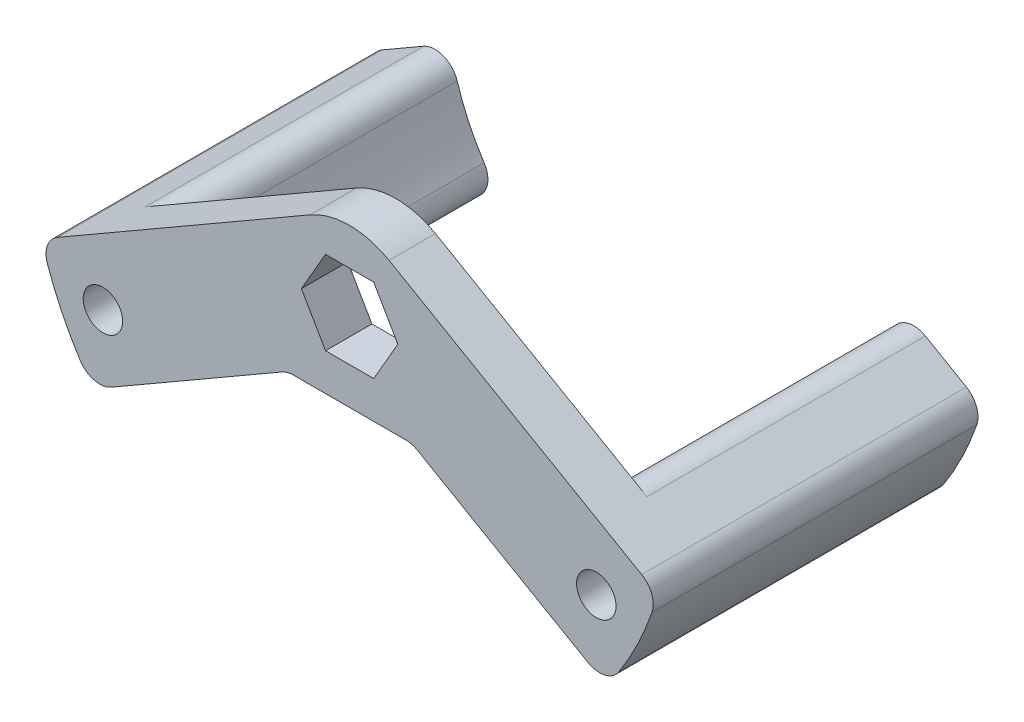
ISO-10303-21;
HEADER;
FILE_DESCRIPTION(('STEP AP214'),'2;1');
FILE_NAME('part.step','',(''),(''),'','','');
FILE_SCHEMA(('AUTOMOTIVE_DESIGN { 1 0 10303 214 1 1 1 1 }'));
ENDSEC;
DATA;
#1=APPLICATION_CONTEXT('core data for automotive mechanical design processes');
#2=APPLICATION_PROTOCOL_DEFINITION('international standard','automotive_design',2000,#1);
#3=PRODUCT_CONTEXT('',#1,'mechanical');
#4=PRODUCT('Part','Part','',(#3));
#5=PRODUCT_RELATED_PRODUCT_CATEGORY('part','',(#4));
#6=PRODUCT_DEFINITION_FORMATION('','',#4);
#7=PRODUCT_DEFINITION_CONTEXT('part definition',#1,'design');
#8=PRODUCT_DEFINITION('design','',#6,#7);
#9=PRODUCT_DEFINITION_SHAPE('','',#8);
#10=(LENGTH_UNIT() NAMED_UNIT(*) SI_UNIT(.MILLI.,.METRE.));
#11=(NAMED_UNIT(*) PLANE_ANGLE_UNIT() SI_UNIT($,.RADIAN.));
#12=(NAMED_UNIT(*) SI_UNIT($,.STERADIAN.) SOLID_ANGLE_UNIT());
#13=UNCERTAINTY_MEASURE_WITH_UNIT(LENGTH_MEASURE(1.E-05),#10,'distance_accuracy_value','');
#14=(GEOMETRIC_REPRESENTATION_CONTEXT(3) GLOBAL_UNCERTAINTY_ASSIGNED_CONTEXT((#13)) GLOBAL_UNIT_ASSIGNED_CONTEXT((#10,
#11,#12)) REPRESENTATION_CONTEXT('',''));
#15=CARTESIAN_POINT('',(0.,0.,0.));
#16=DIRECTION('',(0.,0.,1.));
#17=DIRECTION('',(1.,0.,0.));
#18=AXIS2_PLACEMENT_3D('',#15,#16,#17);
#19=CARTESIAN_POINT('',(0.,0.,-6.));
#20=DIRECTION('',(0.,0.,1.));
#21=DIRECTION('',(1.,0.,0.));
#22=AXIS2_PLACEMENT_3D('',#19,#20,#21);
#23=CYLINDRICAL_SURFACE('',#22,4.9);
#24=CARTESIAN_POINT('',(0.,0.,0.));
#25=DIRECTION('',(0.,0.,1.));
#26=DIRECTION('',(1.,0.,0.));
#27=AXIS2_PLACEMENT_3D('',#24,#25,#26);
#28=CIRCLE('',#27,4.9);
#29=CARTESIAN_POINT('',(-4.68186401958312,-1.44573486578036,0.));
#30=VERTEX_POINT('',#29);
#31=CARTESIAN_POINT('',(-4.10085965776331,-2.68196757387732,0.));
#32=VERTEX_POINT('',#31);
#33=EDGE_CURVE('E297',#30,#32,#28,.T.);
#34=ORIENTED_EDGE('',*,*,#33,.T.);
#35=DIRECTION('',(0.,0.,1.));
#36=VECTOR('',#35,1.);
#37=CARTESIAN_POINT('',(-4.10085965776331,-2.68196757387732,-6.));
#38=LINE('',#37,#36);
#39=CARTESIAN_POINT('',(-4.10085965776331,-2.68196757387732,-6.));
#40=VERTEX_POINT('',#39);
#41=EDGE_CURVE('E320',#32,#40,#38,.F.);
#42=ORIENTED_EDGE('',*,*,#41,.T.);
#43=CARTESIAN_POINT('',(0.,0.,-6.));
#44=DIRECTION('',(0.,0.,-1.));
#45=DIRECTION('',(-1.,0.,0.));
#46=AXIS2_PLACEMENT_3D('',#43,#44,#45);
#47=CIRCLE('',#46,4.9);
#48=CARTESIAN_POINT('',(-4.68186401958312,-1.44573486578036,-6.));
#49=VERTEX_POINT('',#48);
#50=EDGE_CURVE('E430',#40,#49,#47,.T.);
#51=ORIENTED_EDGE('',*,*,#50,.T.);
#52=DIRECTION('',(0.,0.,1.));
#53=VECTOR('',#52,1.);
#54=CARTESIAN_POINT('',(-4.68186401958312,-1.44573486578036,-6.));
#55=LINE('',#54,#53);
#56=EDGE_CURVE('E317',#49,#30,#55,.T.);
#57=ORIENTED_EDGE('',*,*,#56,.T.);
#58=EDGE_LOOP('',(#34,#42,#51,#57));
#59=FACE_BOUND('',#58,.T.);
#60=ADVANCED_FACE('F34',(#59),#23,.F.);
#61=CARTESIAN_POINT('',(0.,0.,-6.));
#62=DIRECTION('',(0.,0.,1.));
#63=DIRECTION('',(1.,0.,0.));
#64=AXIS2_PLACEMENT_3D('',#61,#62,#63);
#65=CYLINDRICAL_SURFACE('',#64,6.9);
#66=CARTESIAN_POINT('',(0.,0.,1.));
#67=DIRECTION('',(0.,0.,1.));
#68=DIRECTION('',(-1.,0.,0.));
#69=AXIS2_PLACEMENT_3D('',#66,#67,#68);
#70=CIRCLE('',#69,6.9);
#71=CARTESIAN_POINT('',(-6.51647108517698,-2.2683925136652,1.));
#72=VERTEX_POINT('',#71);
#73=CARTESIAN_POINT('',(-5.80728796282042,-3.72631272397809,1.));
#74=VERTEX_POINT('',#73);
#75=EDGE_CURVE('E420',#72,#74,#70,.T.);
#76=ORIENTED_EDGE('',*,*,#75,.F.);
#77=DIRECTION('',(0.,0.,1.));
#78=VECTOR('',#77,1.);
#79=CARTESIAN_POINT('',(-6.51647108517698,-2.2683925136652,-6.));
#80=LINE('',#79,#78);
#81=CARTESIAN_POINT('',(-6.51647108517698,-2.2683925136652,-6.));
#82=VERTEX_POINT('',#81);
#83=EDGE_CURVE('E376',#72,#82,#80,.F.);
#84=ORIENTED_EDGE('',*,*,#83,.T.);
#85=CARTESIAN_POINT('',(0.,0.,-6.));
#86=DIRECTION('',(0.,0.,1.));
#87=DIRECTION('',(-1.,0.,0.));
#88=AXIS2_PLACEMENT_3D('',#85,#86,#87);
#89=CIRCLE('',#88,6.9);
#90=CARTESIAN_POINT('',(-5.80728796282042,-3.72631272397809,-6.));
#91=VERTEX_POINT('',#90);
#92=EDGE_CURVE('E426',#82,#91,#89,.T.);
#93=ORIENTED_EDGE('',*,*,#92,.T.);
#94=DIRECTION('',(0.,0.,1.));
#95=VECTOR('',#94,1.);
#96=CARTESIAN_POINT('',(-5.80728796282043,-3.72631272397809,-6.));
#97=LINE('',#96,#95);
#98=EDGE_CURVE('E373',#91,#74,#97,.T.);
#99=ORIENTED_EDGE('',*,*,#98,.T.);
#100=EDGE_LOOP('',(#76,#84,#93,#99));
#101=FACE_BOUND('',#100,.T.);
#102=ADVANCED_FACE('F439',(#101),#65,.T.);
#103=CARTESIAN_POINT('',(0.,0.,-6.));
#104=DIRECTION('',(0.,0.,-1.));
#105=DIRECTION('',(-1.,0.,0.));
#106=AXIS2_PLACEMENT_3D('',#103,#104,#105);
#107=PLANE('',#106);
#108=CARTESIAN_POINT('',(-5.3173272759862,-2.53816456696657,-6.));
#109=DIRECTION('',(0.,0.,-1.));
#110=DIRECTION('',(1.,0.,0.));
#111=AXIS2_PLACEMENT_3D('',#108,#109,#110);
#112=CIRCLE('',#111,0.425);
#113=CARTESIAN_POINT('',(-4.8923272759862,-2.53816456696657,-6.));
#114=VERTEX_POINT('',#113);
#115=EDGE_CURVE('E541',#114,#114,#112,.T.);
#116=ORIENTED_EDGE('',*,*,#115,.F.);
#117=EDGE_LOOP('',(#116));
#118=FACE_BOUND('',#117,.T.);
#119=ORIENTED_EDGE('',*,*,#50,.F.);
#120=CARTESIAN_POINT('',(-4.51931472488201,-2.95563773447704,-6.));
#121=DIRECTION('',(0.,0.,-1.));
#122=DIRECTION('',(-1.,0.,0.));
#123=AXIS2_PLACEMENT_3D('',#120,#121,#122);
#124=CIRCLE('',#123,0.5);
#125=CARTESIAN_POINT('',(-4.26931472488201,-3.38865043636926,-6.));
#126=VERTEX_POINT('',#125);
#127=EDGE_CURVE('E328',#40,#126,#124,.T.);
#128=ORIENTED_EDGE('',*,*,#127,.T.);
#129=DIRECTION('',(0.866025403784439,0.5,0.));
#130=VECTOR('',#129,1.);
#131=CARTESIAN_POINT('',(0.4,-0.69282032302755,-6.));
#132=LINE('',#131,#130);
#133=CARTESIAN_POINT('',(-5.1364699945001,-3.88930276471247,-6.));
#134=VERTEX_POINT('',#133);
#135=EDGE_CURVE('E304',#134,#126,#132,.T.);
#136=ORIENTED_EDGE('',*,*,#135,.F.);
#137=CARTESIAN_POINT('',(-5.3864699945001,-3.45629006282025,-6.));
#138=DIRECTION('',(0.,0.,-1.));
#139=DIRECTION('',(-1.,0.,0.));
#140=AXIS2_PLACEMENT_3D('',#137,#138,#139);
#141=CIRCLE('',#140,0.5);
#142=EDGE_CURVE('E322',#134,#91,#141,.T.);
#143=ORIENTED_EDGE('',*,*,#142,.T.);
#144=ORIENTED_EDGE('',*,*,#92,.F.);
#145=CARTESIAN_POINT('',(-6.04426303552647,-2.10401624455902,-6.));
#146=DIRECTION('',(0.,0.,-1.));
#147=DIRECTION('',(-1.,0.,0.));
#148=AXIS2_PLACEMENT_3D('',#145,#146,#147);
#149=CIRCLE('',#148,0.5);
#150=CARTESIAN_POINT('',(-6.29426303552648,-1.6710035426668,-6.));
#151=VERTEX_POINT('',#150);
#152=EDGE_CURVE('E324',#82,#151,#149,.T.);
#153=ORIENTED_EDGE('',*,*,#152,.T.);
#154=DIRECTION('',(-0.86602540378444,-0.499999999999997,0.));
#155=VECTOR('',#154,1.);
#156=CARTESIAN_POINT('',(-6.6413728942281,-1.87140751302655,-6.));
#157=LINE('',#156,#155);
#158=CARTESIAN_POINT('',(-5.4096052460712,-1.1602461297841,-6.));
#159=VERTEX_POINT('',#158);
#160=EDGE_CURVE('E259',#159,#151,#157,.T.);
#161=ORIENTED_EDGE('',*,*,#160,.F.);
#162=CARTESIAN_POINT('',(-5.15960524607119,-1.59325883167632,-6.));
#163=DIRECTION('',(0.,0.,-1.));
#164=DIRECTION('',(-1.,0.,0.));
#165=AXIS2_PLACEMENT_3D('',#162,#163,#164);
#166=CIRCLE('',#165,0.5);
#167=EDGE_CURVE('E326',#159,#49,#166,.T.);
#168=ORIENTED_EDGE('',*,*,#167,.T.);
#169=EDGE_LOOP('',(#119,#128,#136,#143,#144,#153,#161,#168));
#170=FACE_BOUND('',#169,.T.);
#171=ADVANCED_FACE('F450',(#118,#170),#107,.T.);
#172=CARTESIAN_POINT('',(0.,0.,1.));
#173=DIRECTION('',(0.,0.,1.));
#174=DIRECTION('',(1.,0.,0.));
#175=AXIS2_PLACEMENT_3D('',#172,#173,#174);
#176=PLANE('',#175);
#177=CARTESIAN_POINT('',(5.3173272759862,-2.53816456696657,1.));
#178=DIRECTION('',(0.,0.,-1.));
#179=DIRECTION('',(-1.,0.,0.));
#180=AXIS2_PLACEMENT_3D('',#177,#178,#179);
#181=CIRCLE('',#180,0.425);
#182=CARTESIAN_POINT('',(4.8923272759862,-2.53816456696657,1.));
#183=VERTEX_POINT('',#182);
#184=EDGE_CURVE('E544',#183,#183,#181,.T.);
#185=ORIENTED_EDGE('',*,*,#184,.T.);
#186=EDGE_LOOP('',(#185));
#187=FACE_BOUND('',#186,.T.);
#188=CARTESIAN_POINT('',(-5.3173272759862,-2.53816456696657,1.));
#189=DIRECTION('',(0.,0.,-1.));
#190=DIRECTION('',(1.,0.,0.));
#191=AXIS2_PLACEMENT_3D('',#188,#189,#190);
#192=CIRCLE('',#191,0.425);
#193=CARTESIAN_POINT('',(-4.8923272759862,-2.53816456696657,1.));
#194=VERTEX_POINT('',#193);
#195=EDGE_CURVE('E804',#194,#194,#192,.T.);
#196=ORIENTED_EDGE('',*,*,#195,.T.);
#197=EDGE_LOOP('',(#196));
#198=FACE_BOUND('',#197,.T.);
#199=CARTESIAN_POINT('',(5.80728796282042,-3.72631272397809,1.));
#200=VERTEX_POINT('',#199);
#201=CARTESIAN_POINT('',(6.51647108517698,-2.2683925136652,1.));
#202=VERTEX_POINT('',#201);
#203=EDGE_CURVE('E417',#200,#202,#70,.T.);
#204=ORIENTED_EDGE('',*,*,#203,.T.);
#205=CARTESIAN_POINT('',(6.04426303552648,-2.10401624455902,1.));
#206=DIRECTION('',(0.,0.,1.));
#207=DIRECTION('',(1.,0.,0.));
#208=AXIS2_PLACEMENT_3D('',#205,#206,#207);
#209=CIRCLE('',#208,0.5);
#210=CARTESIAN_POINT('',(6.29426303552648,-1.67100354266681,1.));
#211=VERTEX_POINT('',#210);
#212=EDGE_CURVE('E371',#202,#211,#209,.T.);
#213=ORIENTED_EDGE('',*,*,#212,.T.);
#214=DIRECTION('',(-0.866025403784438,0.500000000000001,0.));
#215=VECTOR('',#214,1.);
#216=CARTESIAN_POINT('',(0.850000000000002,1.47224318643355,1.));
#217=LINE('',#216,#215);
#218=CARTESIAN_POINT('',(0.850000000000002,1.47224318643355,1.));
#219=VERTEX_POINT('',#218);
#220=EDGE_CURVE('E287',#211,#219,#217,.T.);
#221=ORIENTED_EDGE('',*,*,#220,.T.);
#222=CARTESIAN_POINT('',(0.,0.,1.));
#223=DIRECTION('',(0.,0.,1.));
#224=DIRECTION('',(1.,0.,0.));
#225=AXIS2_PLACEMENT_3D('',#222,#223,#224);
#226=CIRCLE('',#225,1.7);
#227=CARTESIAN_POINT('',(-0.850000000000002,1.47224318643355,1.));
#228=VERTEX_POINT('',#227);
#229=EDGE_CURVE('E280',#219,#228,#226,.T.);
#230=ORIENTED_EDGE('',*,*,#229,.T.);
#231=DIRECTION('',(-0.866025403784438,-0.500000000000001,0.));
#232=VECTOR('',#231,1.);
#233=CARTESIAN_POINT('',(-4.82994974842648,-0.825581872181673,1.));
#234=LINE('',#233,#232);
#235=CARTESIAN_POINT('',(-6.29426303552648,-1.67100354266681,1.));
#236=VERTEX_POINT('',#235);
#237=EDGE_CURVE('E283',#228,#236,#234,.T.);
#238=ORIENTED_EDGE('',*,*,#237,.T.);
#239=CARTESIAN_POINT('',(-6.04426303552647,-2.10401624455902,1.));
#240=DIRECTION('',(0.,0.,1.));
#241=DIRECTION('',(1.,0.,0.));
#242=AXIS2_PLACEMENT_3D('',#239,#240,#241);
#243=CIRCLE('',#242,0.5);
#244=EDGE_CURVE('E369',#236,#72,#243,.T.);
#245=ORIENTED_EDGE('',*,*,#244,.T.);
#246=ORIENTED_EDGE('',*,*,#75,.T.);
#247=CARTESIAN_POINT('',(-5.3864699945001,-3.45629006282025,1.));
#248=DIRECTION('',(0.,0.,1.));
#249=DIRECTION('',(1.,0.,0.));
#250=AXIS2_PLACEMENT_3D('',#247,#248,#249);
#251=CIRCLE('',#250,0.5);
#252=CARTESIAN_POINT('',(-5.1364699945001,-3.88930276471247,1.));
#253=VERTEX_POINT('',#252);
#254=EDGE_CURVE('E365',#74,#253,#251,.T.);
#255=ORIENTED_EDGE('',*,*,#254,.T.);
#256=DIRECTION('',(-0.866025403784438,-0.5,0.));
#257=VECTOR('',#256,1.);
#258=CARTESIAN_POINT('',(-1.3444863728671,-1.70000000000001,1.));
#259=LINE('',#258,#257);
#260=CARTESIAN_POINT('',(-1.46051177665154,-1.76698729810779,1.));
#261=VERTEX_POINT('',#260);
#262=EDGE_CURVE('E400',#261,#253,#259,.T.);
#263=ORIENTED_EDGE('',*,*,#262,.F.);
#264=CARTESIAN_POINT('',(-1.21051177665154,-2.20000000000001,1.));
#265=DIRECTION('',(0.,0.,1.));
#266=DIRECTION('',(1.,0.,0.));
#267=AXIS2_PLACEMENT_3D('',#264,#265,#266);
#268=CIRCLE('',#267,0.5);
#269=CARTESIAN_POINT('',(-1.21051177665154,-1.70000000000001,1.));
#270=VERTEX_POINT('',#269);
#271=EDGE_CURVE('E42',#261,#270,#268,.F.);
#272=ORIENTED_EDGE('',*,*,#271,.T.);
#273=DIRECTION('',(-1.,0.,0.));
#274=VECTOR('',#273,1.);
#275=CARTESIAN_POINT('',(-1.3444863728671,-1.70000000000001,1.));
#276=LINE('',#275,#274);
#277=CARTESIAN_POINT('',(1.21051177665153,-1.70000000000001,1.));
#278=VERTEX_POINT('',#277);
#279=EDGE_CURVE('E398',#278,#270,#276,.T.);
#280=ORIENTED_EDGE('',*,*,#279,.F.);
#281=CARTESIAN_POINT('',(1.21051177665153,-2.20000000000001,1.));
#282=DIRECTION('',(0.,0.,1.));
#283=DIRECTION('',(1.,0.,0.));
#284=AXIS2_PLACEMENT_3D('',#281,#282,#283);
#285=CIRCLE('',#284,0.5);
#286=CARTESIAN_POINT('',(1.46051177665153,-1.76698729810779,1.));
#287=VERTEX_POINT('',#286);
#288=EDGE_CURVE('E392',#278,#287,#285,.F.);
#289=ORIENTED_EDGE('',*,*,#288,.T.);
#290=DIRECTION('',(-0.866025403784439,0.5,0.));
#291=VECTOR('',#290,1.);
#292=CARTESIAN_POINT('',(1.34448637286709,-1.70000000000001,1.));
#293=LINE('',#292,#291);
#294=CARTESIAN_POINT('',(5.1364699945001,-3.88930276471248,1.));
#295=VERTEX_POINT('',#294);
#296=EDGE_CURVE('E406',#295,#287,#293,.T.);
#297=ORIENTED_EDGE('',*,*,#296,.F.);
#298=CARTESIAN_POINT('',(5.3864699945001,-3.45629006282026,1.));
#299=DIRECTION('',(0.,0.,1.));
#300=DIRECTION('',(1.,0.,0.));
#301=AXIS2_PLACEMENT_3D('',#298,#299,#300);
#302=CIRCLE('',#301,0.5);
#303=EDGE_CURVE('E367',#295,#200,#302,.T.);
#304=ORIENTED_EDGE('',*,*,#303,.T.);
#305=EDGE_LOOP('',(#204,#213,#221,#230,#238,#245,#246,#255,#263,#272,#280,#289,#297,#304));
#306=FACE_BOUND('',#305,.T.);
#307=DIRECTION('',(-0.500000000000001,0.866025403784438,0.));
#308=VECTOR('',#307,1.);
#309=CARTESIAN_POINT('',(1.03923048454133,0.,1.));
#310=LINE('',#309,#308);
#311=CARTESIAN_POINT('',(1.03923048454133,0.,1.));
#312=VERTEX_POINT('',#311);
#313=CARTESIAN_POINT('',(0.519615242270662,0.900000000000002,1.));
#314=VERTEX_POINT('',#313);
#315=EDGE_CURVE('E231',#312,#314,#310,.T.);
#316=ORIENTED_EDGE('',*,*,#315,.F.);
#317=DIRECTION('',(0.499999999999995,0.866025403784442,0.));
#318=VECTOR('',#317,1.);
#319=CARTESIAN_POINT('',(0.519615242270674,-0.899999999999995,1.));
#320=LINE('',#319,#318);
#321=CARTESIAN_POINT('',(0.519615242270674,-0.899999999999995,1.));
#322=VERTEX_POINT('',#321);
#323=EDGE_CURVE('E221',#322,#312,#320,.T.);
#324=ORIENTED_EDGE('',*,*,#323,.F.);
#325=DIRECTION('',(1.,0.,0.));
#326=VECTOR('',#325,1.);
#327=CARTESIAN_POINT('',(-0.519615242270655,-0.900000000000006,1.));
#328=LINE('',#327,#326);
#329=CARTESIAN_POINT('',(-0.519615242270655,-0.900000000000006,1.));
#330=VERTEX_POINT('',#329);
#331=EDGE_CURVE('E255',#330,#322,#328,.T.);
#332=ORIENTED_EDGE('',*,*,#331,.F.);
#333=DIRECTION('',(0.500000000000007,-0.866025403784435,0.));
#334=VECTOR('',#333,1.);
#335=CARTESIAN_POINT('',(-1.03923048454133,0.,1.));
#336=LINE('',#335,#334);
#337=CARTESIAN_POINT('',(-1.03923048454133,0.,1.));
#338=VERTEX_POINT('',#337);
#339=EDGE_CURVE('E252',#338,#330,#336,.T.);
#340=ORIENTED_EDGE('',*,*,#339,.F.);
#341=DIRECTION('',(-0.499999999999995,-0.866025403784441,0.));
#342=VECTOR('',#341,1.);
#343=CARTESIAN_POINT('',(-0.519615242270668,0.899999999999998,1.));
#344=LINE('',#343,#342);
#345=CARTESIAN_POINT('',(-0.519615242270668,0.899999999999998,1.));
#346=VERTEX_POINT('',#345);
#347=EDGE_CURVE('E247',#346,#338,#344,.T.);
#348=ORIENTED_EDGE('',*,*,#347,.F.);
#349=DIRECTION('',(-1.,0.,0.));
#350=VECTOR('',#349,1.);
#351=CARTESIAN_POINT('',(0.519615242270662,0.900000000000002,1.));
#352=LINE('',#351,#350);
#353=EDGE_CURVE('E245',#314,#346,#352,.T.);
#354=ORIENTED_EDGE('',*,*,#353,.F.);
#355=EDGE_LOOP('',(#316,#324,#332,#340,#348,#354));
#356=FACE_BOUND('',#355,.T.);
#357=ADVANCED_FACE('F243',(#187,#198,#306,#356),#176,.T.);
#358=CARTESIAN_POINT('',(0.,0.,0.));
#359=DIRECTION('',(0.,0.,1.));
#360=DIRECTION('',(1.,0.,0.));
#361=AXIS2_PLACEMENT_3D('',#358,#359,#360);
#362=PLANE('',#361);
#363=DIRECTION('',(-0.866025403784439,0.5,0.));
#364=VECTOR('',#363,1.);
#365=CARTESIAN_POINT('',(-0.400000000000004,-0.692820323027558,0.));
#366=LINE('',#365,#364);
#367=CARTESIAN_POINT('',(4.26931472488201,-3.38865043636927,0.));
#368=VERTEX_POINT('',#367);
#369=CARTESIAN_POINT('',(1.46051177665153,-1.76698729810779,0.));
#370=VERTEX_POINT('',#369);
#371=EDGE_CURVE('E418',#368,#370,#366,.T.);
#372=ORIENTED_EDGE('',*,*,#371,.T.);
#373=CARTESIAN_POINT('',(1.21051177665153,-2.20000000000001,0.));
#374=DIRECTION('',(0.,0.,1.));
#375=DIRECTION('',(1.,0.,0.));
#376=AXIS2_PLACEMENT_3D('',#373,#374,#375);
#377=CIRCLE('',#376,0.5);
#378=CARTESIAN_POINT('',(1.21051177665153,-1.70000000000001,0.));
#379=VERTEX_POINT('',#378);
#380=EDGE_CURVE('E56',#370,#379,#377,.T.);
#381=ORIENTED_EDGE('',*,*,#380,.T.);
#382=DIRECTION('',(-1.,0.,0.));
#383=VECTOR('',#382,1.);
#384=CARTESIAN_POINT('',(0.,-1.70000000000001,0.));
#385=LINE('',#384,#383);
#386=CARTESIAN_POINT('',(-1.21051177665154,-1.70000000000001,0.));
#387=VERTEX_POINT('',#386);
#388=EDGE_CURVE('E307',#379,#387,#385,.T.);
#389=ORIENTED_EDGE('',*,*,#388,.T.);
#390=CARTESIAN_POINT('',(-1.21051177665154,-2.20000000000001,0.));
#391=DIRECTION('',(0.,0.,1.));
#392=DIRECTION('',(1.,0.,0.));
#393=AXIS2_PLACEMENT_3D('',#390,#391,#392);
#394=CIRCLE('',#393,0.5);
#395=CARTESIAN_POINT('',(-1.46051177665154,-1.76698729810779,0.));
#396=VERTEX_POINT('',#395);
#397=EDGE_CURVE('E11',#387,#396,#394,.T.);
#398=ORIENTED_EDGE('',*,*,#397,.T.);
#399=DIRECTION('',(-0.866025403784439,-0.5,0.));
#400=VECTOR('',#399,1.);
#401=CARTESIAN_POINT('',(0.4,-0.69282032302755,0.));
#402=LINE('',#401,#400);
#403=CARTESIAN_POINT('',(-4.26931472488201,-3.38865043636926,0.));
#404=VERTEX_POINT('',#403);
#405=EDGE_CURVE('E412',#396,#404,#402,.T.);
#406=ORIENTED_EDGE('',*,*,#405,.T.);
#407=CARTESIAN_POINT('',(-4.51931472488201,-2.95563773447704,0.));
#408=DIRECTION('',(0.,0.,1.));
#409=DIRECTION('',(1.,0.,0.));
#410=AXIS2_PLACEMENT_3D('',#407,#408,#409);
#411=CIRCLE('',#410,0.5);
#412=EDGE_CURVE('E382',#404,#32,#411,.T.);
#413=ORIENTED_EDGE('',*,*,#412,.T.);
#414=ORIENTED_EDGE('',*,*,#33,.F.);
#415=CARTESIAN_POINT('',(-5.15960524607119,-1.59325883167632,0.));
#416=DIRECTION('',(0.,0.,1.));
#417=DIRECTION('',(1.,0.,0.));
#418=AXIS2_PLACEMENT_3D('',#415,#416,#417);
#419=CIRCLE('',#418,0.5);
#420=CARTESIAN_POINT('',(-5.4096052460712,-1.1602461297841,0.));
#421=VERTEX_POINT('',#420);
#422=EDGE_CURVE('E389',#30,#421,#419,.T.);
#423=ORIENTED_EDGE('',*,*,#422,.T.);
#424=DIRECTION('',(-0.866025403784438,-0.500000000000001,0.));
#425=VECTOR('',#424,1.);
#426=CARTESIAN_POINT('',(-4.82994974842648,-0.825581872181673,0.));
#427=LINE('',#426,#425);
#428=CARTESIAN_POINT('',(-0.850000000000002,1.47224318643355,0.));
#429=VERTEX_POINT('',#428);
#430=EDGE_CURVE('E292',#429,#421,#427,.T.);
#431=ORIENTED_EDGE('',*,*,#430,.F.);
#432=CARTESIAN_POINT('',(0.,0.,0.));
#433=DIRECTION('',(0.,0.,1.));
#434=DIRECTION('',(1.,0.,0.));
#435=AXIS2_PLACEMENT_3D('',#432,#433,#434);
#436=CIRCLE('',#435,1.7);
#437=CARTESIAN_POINT('',(0.850000000000002,1.47224318643355,0.));
#438=VERTEX_POINT('',#437);
#439=EDGE_CURVE('E239',#438,#429,#436,.T.);
#440=ORIENTED_EDGE('',*,*,#439,.F.);
#441=DIRECTION('',(-0.866025403784438,0.500000000000001,0.));
#442=VECTOR('',#441,1.);
#443=CARTESIAN_POINT('',(0.850000000000002,1.47224318643355,0.));
#444=LINE('',#443,#442);
#445=CARTESIAN_POINT('',(5.4096052460712,-1.1602461297841,0.));
#446=VERTEX_POINT('',#445);
#447=EDGE_CURVE('E284',#446,#438,#444,.T.);
#448=ORIENTED_EDGE('',*,*,#447,.F.);
#449=CARTESIAN_POINT('',(5.1596052460712,-1.59325883167632,0.));
#450=DIRECTION('',(0.,0.,1.));
#451=DIRECTION('',(1.,0.,0.));
#452=AXIS2_PLACEMENT_3D('',#449,#450,#451);
#453=CIRCLE('',#452,0.5);
#454=CARTESIAN_POINT('',(4.68186401958312,-1.44573486578036,0.));
#455=VERTEX_POINT('',#454);
#456=EDGE_CURVE('E387',#446,#455,#453,.T.);
#457=ORIENTED_EDGE('',*,*,#456,.T.);
#458=CARTESIAN_POINT('',(4.1008596577633,-2.68196757387732,0.));
#459=VERTEX_POINT('',#458);
#460=EDGE_CURVE('E294',#459,#455,#28,.T.);
#461=ORIENTED_EDGE('',*,*,#460,.F.);
#462=CARTESIAN_POINT('',(4.51931472488201,-2.95563773447705,0.));
#463=DIRECTION('',(0.,0.,1.));
#464=DIRECTION('',(1.,0.,0.));
#465=AXIS2_PLACEMENT_3D('',#462,#463,#464);
#466=CIRCLE('',#465,0.5);
#467=EDGE_CURVE('E384',#459,#368,#466,.T.);
#468=ORIENTED_EDGE('',*,*,#467,.T.);
#469=EDGE_LOOP('',(#372,#381,#389,#398,#406,#413,#414,#423,#431,#440,#448,#457,#461,#468));
#470=FACE_BOUND('',#469,.T.);
#471=DIRECTION('',(0.499999999999995,0.866025403784442,0.));
#472=VECTOR('',#471,1.);
#473=CARTESIAN_POINT('',(0.519615242270674,-0.899999999999995,0.));
#474=LINE('',#473,#472);
#475=CARTESIAN_POINT('',(0.519615242270674,-0.899999999999995,0.));
#476=VERTEX_POINT('',#475);
#477=CARTESIAN_POINT('',(1.03923048454133,0.,0.));
#478=VERTEX_POINT('',#477);
#479=EDGE_CURVE('E257',#476,#478,#474,.T.);
#480=ORIENTED_EDGE('',*,*,#479,.T.);
#481=DIRECTION('',(-0.500000000000001,0.866025403784438,0.));
#482=VECTOR('',#481,1.);
#483=CARTESIAN_POINT('',(1.03923048454133,0.,0.));
#484=LINE('',#483,#482);
#485=CARTESIAN_POINT('',(0.519615242270662,0.900000000000002,0.));
#486=VERTEX_POINT('',#485);
#487=EDGE_CURVE('E238',#478,#486,#484,.T.);
#488=ORIENTED_EDGE('',*,*,#487,.T.);
#489=DIRECTION('',(-1.,0.,0.));
#490=VECTOR('',#489,1.);
#491=CARTESIAN_POINT('',(0.519615242270662,0.900000000000002,0.));
#492=LINE('',#491,#490);
#493=CARTESIAN_POINT('',(-0.519615242270668,0.899999999999998,0.));
#494=VERTEX_POINT('',#493);
#495=EDGE_CURVE('E261',#486,#494,#492,.T.);
#496=ORIENTED_EDGE('',*,*,#495,.T.);
#497=DIRECTION('',(-0.499999999999995,-0.866025403784441,0.));
#498=VECTOR('',#497,1.);
#499=CARTESIAN_POINT('',(-0.519615242270668,0.899999999999998,0.));
#500=LINE('',#499,#498);
#501=CARTESIAN_POINT('',(-1.03923048454133,0.,0.));
#502=VERTEX_POINT('',#501);
#503=EDGE_CURVE('E264',#494,#502,#500,.T.);
#504=ORIENTED_EDGE('',*,*,#503,.T.);
#505=DIRECTION('',(0.500000000000007,-0.866025403784435,0.));
#506=VECTOR('',#505,1.);
#507=CARTESIAN_POINT('',(-1.03923048454133,0.,0.));
#508=LINE('',#507,#506);
#509=CARTESIAN_POINT('',(-0.519615242270655,-0.900000000000006,0.));
#510=VERTEX_POINT('',#509);
#511=EDGE_CURVE('E267',#502,#510,#508,.T.);
#512=ORIENTED_EDGE('',*,*,#511,.T.);
#513=DIRECTION('',(1.,0.,0.));
#514=VECTOR('',#513,1.);
#515=CARTESIAN_POINT('',(-0.519615242270655,-0.900000000000006,0.));
#516=LINE('',#515,#514);
#517=EDGE_CURVE('E232',#510,#476,#516,.T.);
#518=ORIENTED_EDGE('',*,*,#517,.T.);
#519=EDGE_LOOP('',(#480,#488,#496,#504,#512,#518));
#520=FACE_BOUND('',#519,.T.);
#521=ADVANCED_FACE('F410',(#470,#520),#362,.F.);
#522=CARTESIAN_POINT('',(0.,0.,1.));
#523=DIRECTION('',(0.,0.,-1.));
#524=DIRECTION('',(-1.,0.,0.));
#525=AXIS2_PLACEMENT_3D('',#522,#523,#524);
#526=CYLINDRICAL_SURFACE('',#525,1.7);
#527=ORIENTED_EDGE('',*,*,#439,.T.);
#528=DIRECTION('',(0.,0.,-1.));
#529=VECTOR('',#528,1.);
#530=CARTESIAN_POINT('',(-0.850000000000002,1.47224318643355,1.));
#531=LINE('',#530,#529);
#532=EDGE_CURVE('E301',#228,#429,#531,.T.);
#533=ORIENTED_EDGE('',*,*,#532,.F.);
#534=ORIENTED_EDGE('',*,*,#229,.F.);
#535=DIRECTION('',(0.,0.,-1.));
#536=VECTOR('',#535,1.);
#537=CARTESIAN_POINT('',(0.850000000000002,1.47224318643355,1.));
#538=LINE('',#537,#536);
#539=EDGE_CURVE('E289',#219,#438,#538,.T.);
#540=ORIENTED_EDGE('',*,*,#539,.T.);
#541=EDGE_LOOP('',(#527,#533,#534,#540));
#542=FACE_BOUND('',#541,.T.);
#543=ADVANCED_FACE('F550',(#542),#526,.T.);
#544=CARTESIAN_POINT('',(-4.82994974842648,-0.825581872181673,1.));
#545=DIRECTION('',(0.500000000000001,-0.866025403784438,0.));
#546=DIRECTION('',(0.866025403784438,0.500000000000001,0.));
#547=AXIS2_PLACEMENT_3D('',#544,#545,#546);
#548=PLANE('',#547);
#549=ORIENTED_EDGE('',*,*,#430,.T.);
#550=DIRECTION('',(0.,0.,-1.));
#551=VECTOR('',#550,1.);
#552=CARTESIAN_POINT('',(-5.4096052460712,-1.1602461297841,-6.));
#553=LINE('',#552,#551);
#554=EDGE_CURVE('E358',#421,#159,#553,.T.);
#555=ORIENTED_EDGE('',*,*,#554,.T.);
#556=ORIENTED_EDGE('',*,*,#160,.T.);
#557=DIRECTION('',(0.,0.,-1.));
#558=VECTOR('',#557,1.);
#559=CARTESIAN_POINT('',(-6.29426303552648,-1.67100354266681,1.));
#560=LINE('',#559,#558);
#561=EDGE_CURVE('E355',#151,#236,#560,.F.);
#562=ORIENTED_EDGE('',*,*,#561,.T.);
#563=ORIENTED_EDGE('',*,*,#237,.F.);
#564=ORIENTED_EDGE('',*,*,#532,.T.);
#565=EDGE_LOOP('',(#549,#555,#556,#562,#563,#564));
#566=FACE_BOUND('',#565,.T.);
#567=ADVANCED_FACE('F453',(#566),#548,.F.);
#568=CARTESIAN_POINT('',(0.850000000000002,1.47224318643355,1.));
#569=DIRECTION('',(-0.500000000000001,-0.866025403784438,0.));
#570=DIRECTION('',(0.866025403784438,-0.500000000000001,0.));
#571=AXIS2_PLACEMENT_3D('',#568,#569,#570);
#572=PLANE('',#571);
#573=DIRECTION('',(-0.866025403784439,0.5,0.));
#574=VECTOR('',#573,1.);
#575=CARTESIAN_POINT('',(6.6413728942281,-1.87140751302656,-6.));
#576=LINE('',#575,#574);
#577=CARTESIAN_POINT('',(6.29426303552648,-1.6710035426668,-6.));
#578=VERTEX_POINT('',#577);
#579=CARTESIAN_POINT('',(5.4096052460712,-1.1602461297841,-6.));
#580=VERTEX_POINT('',#579);
#581=EDGE_CURVE('E427',#578,#580,#576,.T.);
#582=ORIENTED_EDGE('',*,*,#581,.T.);
#583=DIRECTION('',(0.,0.,-1.));
#584=VECTOR('',#583,1.);
#585=CARTESIAN_POINT('',(5.4096052460712,-1.1602461297841,0.));
#586=LINE('',#585,#584);
#587=EDGE_CURVE('E352',#580,#446,#586,.F.);
#588=ORIENTED_EDGE('',*,*,#587,.T.);
#589=ORIENTED_EDGE('',*,*,#447,.T.);
#590=ORIENTED_EDGE('',*,*,#539,.F.);
#591=ORIENTED_EDGE('',*,*,#220,.F.);
#592=DIRECTION('',(0.,0.,-1.));
#593=VECTOR('',#592,1.);
#594=CARTESIAN_POINT('',(6.29426303552648,-1.67100354266681,-6.));
#595=LINE('',#594,#593);
#596=EDGE_CURVE('E350',#211,#578,#595,.T.);
#597=ORIENTED_EDGE('',*,*,#596,.T.);
#598=EDGE_LOOP('',(#582,#588,#589,#590,#591,#597));
#599=FACE_BOUND('',#598,.T.);
#600=ADVANCED_FACE('F521',(#599),#572,.F.);
#601=CARTESIAN_POINT('',(0.519615242270674,-0.899999999999995,1.));
#602=DIRECTION('',(-0.866025403784441,0.499999999999995,0.));
#603=DIRECTION('',(-0.499999999999995,-0.866025403784442,0.));
#604=AXIS2_PLACEMENT_3D('',#601,#602,#603);
#605=PLANE('',#604);
#606=ORIENTED_EDGE('',*,*,#479,.F.);
#607=DIRECTION('',(0.,0.,-1.));
#608=VECTOR('',#607,1.);
#609=CARTESIAN_POINT('',(0.519615242270674,-0.899999999999995,1.));
#610=LINE('',#609,#608);
#611=EDGE_CURVE('E227',#322,#476,#610,.T.);
#612=ORIENTED_EDGE('',*,*,#611,.F.);
#613=ORIENTED_EDGE('',*,*,#323,.T.);
#614=DIRECTION('',(0.,0.,-1.));
#615=VECTOR('',#614,1.);
#616=CARTESIAN_POINT('',(1.03923048454133,0.,1.));
#617=LINE('',#616,#615);
#618=EDGE_CURVE('E224',#312,#478,#617,.T.);
#619=ORIENTED_EDGE('',*,*,#618,.T.);
#620=EDGE_LOOP('',(#606,#612,#613,#619));
#621=FACE_BOUND('',#620,.T.);
#622=ADVANCED_FACE('F223',(#621),#605,.T.);
#623=CARTESIAN_POINT('',(1.03923048454133,0.,1.));
#624=DIRECTION('',(-0.866025403784438,-0.500000000000001,0.));
#625=DIRECTION('',(0.500000000000001,-0.866025403784438,0.));
#626=AXIS2_PLACEMENT_3D('',#623,#624,#625);
#627=PLANE('',#626);
#628=ORIENTED_EDGE('',*,*,#487,.F.);
#629=ORIENTED_EDGE('',*,*,#618,.F.);
#630=ORIENTED_EDGE('',*,*,#315,.T.);
#631=DIRECTION('',(0.,0.,-1.));
#632=VECTOR('',#631,1.);
#633=CARTESIAN_POINT('',(0.519615242270662,0.900000000000002,1.));
#634=LINE('',#633,#632);
#635=EDGE_CURVE('E240',#314,#486,#634,.T.);
#636=ORIENTED_EDGE('',*,*,#635,.T.);
#637=EDGE_LOOP('',(#628,#629,#630,#636));
#638=FACE_BOUND('',#637,.T.);
#639=ADVANCED_FACE('F235',(#638),#627,.T.);
#640=CARTESIAN_POINT('',(0.519615242270662,0.900000000000002,1.));
#641=DIRECTION('',(0.,-1.,0.));
#642=DIRECTION('',(1.,0.,0.));
#643=AXIS2_PLACEMENT_3D('',#640,#641,#642);
#644=PLANE('',#643);
#645=ORIENTED_EDGE('',*,*,#495,.F.);
#646=ORIENTED_EDGE('',*,*,#635,.F.);
#647=ORIENTED_EDGE('',*,*,#353,.T.);
#648=DIRECTION('',(0.,0.,-1.));
#649=VECTOR('',#648,1.);
#650=CARTESIAN_POINT('',(-0.519615242270668,0.899999999999998,1.));
#651=LINE('',#650,#649);
#652=EDGE_CURVE('E277',#346,#494,#651,.T.);
#653=ORIENTED_EDGE('',*,*,#652,.T.);
#654=EDGE_LOOP('',(#645,#646,#647,#653));
#655=FACE_BOUND('',#654,.T.);
#656=ADVANCED_FACE('F750',(#655),#644,.T.);
#657=CARTESIAN_POINT('',(-0.519615242270668,0.899999999999998,1.));
#658=DIRECTION('',(0.866025403784441,-0.499999999999995,0.));
#659=DIRECTION('',(0.499999999999995,0.866025403784442,0.));
#660=AXIS2_PLACEMENT_3D('',#657,#658,#659);
#661=PLANE('',#660);
#662=ORIENTED_EDGE('',*,*,#503,.F.);
#663=ORIENTED_EDGE('',*,*,#652,.F.);
#664=ORIENTED_EDGE('',*,*,#347,.T.);
#665=DIRECTION('',(0.,0.,-1.));
#666=VECTOR('',#665,1.);
#667=CARTESIAN_POINT('',(-1.03923048454133,0.,1.));
#668=LINE('',#667,#666);
#669=EDGE_CURVE('E275',#338,#502,#668,.T.);
#670=ORIENTED_EDGE('',*,*,#669,.T.);
#671=EDGE_LOOP('',(#662,#663,#664,#670));
#672=FACE_BOUND('',#671,.T.);
#673=ADVANCED_FACE('F741',(#672),#661,.T.);
#674=CARTESIAN_POINT('',(-1.03923048454133,0.,1.));
#675=DIRECTION('',(0.866025403784435,0.500000000000007,0.));
#676=DIRECTION('',(-0.500000000000007,0.866025403784434,0.));
#677=AXIS2_PLACEMENT_3D('',#674,#675,#676);
#678=PLANE('',#677);
#679=ORIENTED_EDGE('',*,*,#511,.F.);
#680=ORIENTED_EDGE('',*,*,#669,.F.);
#681=ORIENTED_EDGE('',*,*,#339,.T.);
#682=DIRECTION('',(0.,0.,-1.));
#683=VECTOR('',#682,1.);
#684=CARTESIAN_POINT('',(-0.519615242270655,-0.900000000000006,1.));
#685=LINE('',#684,#683);
#686=EDGE_CURVE('E273',#330,#510,#685,.T.);
#687=ORIENTED_EDGE('',*,*,#686,.T.);
#688=EDGE_LOOP('',(#679,#680,#681,#687));
#689=FACE_BOUND('',#688,.T.);
#690=ADVANCED_FACE('F500',(#689),#678,.T.);
#691=CARTESIAN_POINT('',(-0.519615242270655,-0.900000000000006,1.));
#692=DIRECTION('',(0.,1.,0.));
#693=DIRECTION('',(-1.,0.,0.));
#694=AXIS2_PLACEMENT_3D('',#691,#692,#693);
#695=PLANE('',#694);
#696=ORIENTED_EDGE('',*,*,#517,.F.);
#697=ORIENTED_EDGE('',*,*,#686,.F.);
#698=ORIENTED_EDGE('',*,*,#331,.T.);
#699=ORIENTED_EDGE('',*,*,#611,.T.);
#700=EDGE_LOOP('',(#696,#697,#698,#699));
#701=FACE_BOUND('',#700,.T.);
#702=ADVANCED_FACE('F492',(#701),#695,.T.);
#703=CARTESIAN_POINT('',(4.68186401958312,-1.44573486578036,-6.));
#704=VERTEX_POINT('',#703);
#705=CARTESIAN_POINT('',(4.1008596577633,-2.68196757387732,-6.));
#706=VERTEX_POINT('',#705);
#707=EDGE_CURVE('E431',#704,#706,#47,.T.);
#708=ORIENTED_EDGE('',*,*,#707,.T.);
#709=DIRECTION('',(0.,0.,1.));
#710=VECTOR('',#709,1.);
#711=CARTESIAN_POINT('',(4.1008596577633,-2.68196757387732,-6.));
#712=LINE('',#711,#710);
#713=EDGE_CURVE('E348',#706,#459,#712,.T.);
#714=ORIENTED_EDGE('',*,*,#713,.T.);
#715=ORIENTED_EDGE('',*,*,#460,.T.);
#716=DIRECTION('',(0.,0.,1.));
#717=VECTOR('',#716,1.);
#718=CARTESIAN_POINT('',(4.68186401958312,-1.44573486578036,-6.));
#719=LINE('',#718,#717);
#720=EDGE_CURVE('E346',#455,#704,#719,.F.);
#721=ORIENTED_EDGE('',*,*,#720,.T.);
#722=EDGE_LOOP('',(#708,#714,#715,#721));
#723=FACE_BOUND('',#722,.T.);
#724=ADVANCED_FACE('F484',(#723),#23,.F.);
#725=CARTESIAN_POINT('',(5.80728796282042,-3.72631272397809,-6.));
#726=VERTEX_POINT('',#725);
#727=CARTESIAN_POINT('',(6.51647108517698,-2.2683925136652,-6.));
#728=VERTEX_POINT('',#727);
#729=EDGE_CURVE('E423',#726,#728,#89,.T.);
#730=ORIENTED_EDGE('',*,*,#729,.T.);
#731=DIRECTION('',(0.,0.,1.));
#732=VECTOR('',#731,1.);
#733=CARTESIAN_POINT('',(6.51647108517698,-2.2683925136652,-6.));
#734=LINE('',#733,#732);
#735=EDGE_CURVE('E362',#728,#202,#734,.T.);
#736=ORIENTED_EDGE('',*,*,#735,.T.);
#737=ORIENTED_EDGE('',*,*,#203,.F.);
#738=DIRECTION('',(0.,0.,1.));
#739=VECTOR('',#738,1.);
#740=CARTESIAN_POINT('',(5.80728796282042,-3.72631272397809,-6.));
#741=LINE('',#740,#739);
#742=EDGE_CURVE('E360',#200,#726,#741,.F.);
#743=ORIENTED_EDGE('',*,*,#742,.T.);
#744=EDGE_LOOP('',(#730,#736,#737,#743));
#745=FACE_BOUND('',#744,.T.);
#746=ADVANCED_FACE('F489',(#745),#65,.T.);
#747=CARTESIAN_POINT('',(5.3173272759862,-2.53816456696657,-6.));
#748=DIRECTION('',(0.,0.,-1.));
#749=DIRECTION('',(-1.,0.,0.));
#750=AXIS2_PLACEMENT_3D('',#747,#748,#749);
#751=CIRCLE('',#750,0.425);
#752=CARTESIAN_POINT('',(4.8923272759862,-2.53816456696657,-6.));
#753=VERTEX_POINT('',#752);
#754=EDGE_CURVE('E805',#753,#753,#751,.T.);
#755=ORIENTED_EDGE('',*,*,#754,.F.);
#756=EDGE_LOOP('',(#755));
#757=FACE_BOUND('',#756,.T.);
#758=DIRECTION('',(-0.866025403784439,0.5,0.));
#759=VECTOR('',#758,1.);
#760=CARTESIAN_POINT('',(1.34448637286709,-1.70000000000001,-6.));
#761=LINE('',#760,#759);
#762=CARTESIAN_POINT('',(5.1364699945001,-3.88930276471248,-6.));
#763=VERTEX_POINT('',#762);
#764=CARTESIAN_POINT('',(4.26931472488201,-3.38865043636927,-6.));
#765=VERTEX_POINT('',#764);
#766=EDGE_CURVE('E405',#763,#765,#761,.T.);
#767=ORIENTED_EDGE('',*,*,#766,.T.);
#768=CARTESIAN_POINT('',(4.51931472488201,-2.95563773447705,-6.));
#769=DIRECTION('',(0.,0.,-1.));
#770=DIRECTION('',(-1.,0.,0.));
#771=AXIS2_PLACEMENT_3D('',#768,#769,#770);
#772=CIRCLE('',#771,0.5);
#773=EDGE_CURVE('E344',#765,#706,#772,.T.);
#774=ORIENTED_EDGE('',*,*,#773,.T.);
#775=ORIENTED_EDGE('',*,*,#707,.F.);
#776=CARTESIAN_POINT('',(5.1596052460712,-1.59325883167632,-6.));
#777=DIRECTION('',(0.,0.,-1.));
#778=DIRECTION('',(-1.,0.,0.));
#779=AXIS2_PLACEMENT_3D('',#776,#777,#778);
#780=CIRCLE('',#779,0.5);
#781=EDGE_CURVE('E342',#704,#580,#780,.T.);
#782=ORIENTED_EDGE('',*,*,#781,.T.);
#783=ORIENTED_EDGE('',*,*,#581,.F.);
#784=CARTESIAN_POINT('',(6.04426303552648,-2.10401624455902,-6.));
#785=DIRECTION('',(0.,0.,-1.));
#786=DIRECTION('',(-1.,0.,0.));
#787=AXIS2_PLACEMENT_3D('',#784,#785,#786);
#788=CIRCLE('',#787,0.5);
#789=EDGE_CURVE('E340',#578,#728,#788,.T.);
#790=ORIENTED_EDGE('',*,*,#789,.T.);
#791=ORIENTED_EDGE('',*,*,#729,.F.);
#792=CARTESIAN_POINT('',(5.3864699945001,-3.45629006282026,-6.));
#793=DIRECTION('',(0.,0.,-1.));
#794=DIRECTION('',(-1.,0.,0.));
#795=AXIS2_PLACEMENT_3D('',#792,#793,#794);
#796=CIRCLE('',#795,0.5);
#797=EDGE_CURVE('E338',#726,#763,#796,.T.);
#798=ORIENTED_EDGE('',*,*,#797,.T.);
#799=EDGE_LOOP('',(#767,#774,#775,#782,#783,#790,#791,#798));
#800=FACE_BOUND('',#799,.T.);
#801=ADVANCED_FACE('F498',(#757,#800),#107,.T.);
#802=CARTESIAN_POINT('',(-1.3444863728671,-1.70000000000001,-6.));
#803=DIRECTION('',(0.,1.,0.));
#804=DIRECTION('',(-1.,0.,0.));
#805=AXIS2_PLACEMENT_3D('',#802,#803,#804);
#806=PLANE('',#805);
#807=ORIENTED_EDGE('',*,*,#388,.F.);
#808=DIRECTION('',(0.,0.,1.));
#809=VECTOR('',#808,1.);
#810=CARTESIAN_POINT('',(1.21051177665153,-1.70000000000001,1.));
#811=LINE('',#810,#809);
#812=EDGE_CURVE('E379',#379,#278,#811,.T.);
#813=ORIENTED_EDGE('',*,*,#812,.T.);
#814=ORIENTED_EDGE('',*,*,#279,.T.);
#815=DIRECTION('',(0.,0.,1.));
#816=VECTOR('',#815,1.);
#817=CARTESIAN_POINT('',(-1.21051177665154,-1.70000000000001,0.));
#818=LINE('',#817,#816);
#819=EDGE_CURVE('E49',#270,#387,#818,.F.);
#820=ORIENTED_EDGE('',*,*,#819,.T.);
#821=EDGE_LOOP('',(#807,#813,#814,#820));
#822=FACE_BOUND('',#821,.T.);
#823=ADVANCED_FACE('F403',(#822),#806,.F.);
#824=CARTESIAN_POINT('',(-1.3444863728671,-1.70000000000001,-6.));
#825=DIRECTION('',(-0.5,0.866025403784438,0.));
#826=DIRECTION('',(-0.866025403784439,-0.5,0.));
#827=AXIS2_PLACEMENT_3D('',#824,#825,#826);
#828=PLANE('',#827);
#829=ORIENTED_EDGE('',*,*,#135,.T.);
#830=DIRECTION('',(0.,0.,-1.));
#831=VECTOR('',#830,1.);
#832=CARTESIAN_POINT('',(-4.26931472488201,-3.38865043636926,0.));
#833=LINE('',#832,#831);
#834=EDGE_CURVE('E314',#126,#404,#833,.F.);
#835=ORIENTED_EDGE('',*,*,#834,.T.);
#836=ORIENTED_EDGE('',*,*,#405,.F.);
#837=DIRECTION('',(0.,0.,1.));
#838=VECTOR('',#837,1.);
#839=CARTESIAN_POINT('',(-1.46051177665154,-1.76698729810779,1.));
#840=LINE('',#839,#838);
#841=EDGE_CURVE('E309',#396,#261,#840,.T.);
#842=ORIENTED_EDGE('',*,*,#841,.T.);
#843=ORIENTED_EDGE('',*,*,#262,.T.);
#844=DIRECTION('',(0.,0.,-1.));
#845=VECTOR('',#844,1.);
#846=CARTESIAN_POINT('',(-5.1364699945001,-3.88930276471247,-6.));
#847=LINE('',#846,#845);
#848=EDGE_CURVE('E312',#253,#134,#847,.T.);
#849=ORIENTED_EDGE('',*,*,#848,.T.);
#850=EDGE_LOOP('',(#829,#835,#836,#842,#843,#849));
#851=FACE_BOUND('',#850,.T.);
#852=ADVANCED_FACE('F415',(#851),#828,.F.);
#853=CARTESIAN_POINT('',(1.34448637286709,-1.70000000000001,-6.));
#854=DIRECTION('',(0.5,0.866025403784439,0.));
#855=DIRECTION('',(-0.866025403784439,0.5,0.));
#856=AXIS2_PLACEMENT_3D('',#853,#854,#855);
#857=PLANE('',#856);
#858=ORIENTED_EDGE('',*,*,#371,.F.);
#859=DIRECTION('',(0.,0.,-1.));
#860=VECTOR('',#859,1.);
#861=CARTESIAN_POINT('',(4.26931472488201,-3.38865043636927,-6.));
#862=LINE('',#861,#860);
#863=EDGE_CURVE('E335',#368,#765,#862,.T.);
#864=ORIENTED_EDGE('',*,*,#863,.T.);
#865=ORIENTED_EDGE('',*,*,#766,.F.);
#866=DIRECTION('',(0.,0.,-1.));
#867=VECTOR('',#866,1.);
#868=CARTESIAN_POINT('',(5.1364699945001,-3.88930276471248,1.));
#869=LINE('',#868,#867);
#870=EDGE_CURVE('E332',#763,#295,#869,.F.);
#871=ORIENTED_EDGE('',*,*,#870,.T.);
#872=ORIENTED_EDGE('',*,*,#296,.T.);
#873=DIRECTION('',(0.,0.,1.));
#874=VECTOR('',#873,1.);
#875=CARTESIAN_POINT('',(1.46051177665153,-1.76698729810779,0.));
#876=LINE('',#875,#874);
#877=EDGE_CURVE('E330',#287,#370,#876,.F.);
#878=ORIENTED_EDGE('',*,*,#877,.T.);
#879=EDGE_LOOP('',(#858,#864,#865,#871,#872,#878));
#880=FACE_BOUND('',#879,.T.);
#881=ADVANCED_FACE('F535',(#880),#857,.F.);
#882=CARTESIAN_POINT('',(5.3173272759862,-2.53816456696657,1.));
#883=DIRECTION('',(0.,0.,-1.));
#884=DIRECTION('',(-1.,0.,0.));
#885=AXIS2_PLACEMENT_3D('',#882,#883,#884);
#886=CYLINDRICAL_SURFACE('',#885,0.425);
#887=ORIENTED_EDGE('',*,*,#184,.F.);
#888=EDGE_LOOP('',(#887));
#889=FACE_BOUND('',#888,.T.);
#890=ORIENTED_EDGE('',*,*,#754,.T.);
#891=EDGE_LOOP('',(#890));
#892=FACE_BOUND('',#891,.T.);
#893=ADVANCED_FACE('F635',(#889,#892),#886,.F.);
#894=CARTESIAN_POINT('',(-5.3173272759862,-2.53816456696657,1.));
#895=DIRECTION('',(0.,0.,-1.));
#896=DIRECTION('',(-1.,0.,0.));
#897=AXIS2_PLACEMENT_3D('',#894,#895,#896);
#898=CYLINDRICAL_SURFACE('',#897,0.425);
#899=ORIENTED_EDGE('',*,*,#195,.F.);
#900=EDGE_LOOP('',(#899));
#901=FACE_BOUND('',#900,.T.);
#902=ORIENTED_EDGE('',*,*,#115,.T.);
#903=EDGE_LOOP('',(#902));
#904=FACE_BOUND('',#903,.T.);
#905=ADVANCED_FACE('F563',(#901,#904),#898,.F.);
#906=CARTESIAN_POINT('',(-4.51931472488201,-2.95563773447704,-6.));
#907=DIRECTION('',(0.,0.,1.));
#908=DIRECTION('',(1.,0.,0.));
#909=AXIS2_PLACEMENT_3D('',#906,#907,#908);
#910=CYLINDRICAL_SURFACE('',#909,0.5);
#911=ORIENTED_EDGE('',*,*,#127,.F.);
#912=ORIENTED_EDGE('',*,*,#41,.F.);
#913=ORIENTED_EDGE('',*,*,#412,.F.);
#914=ORIENTED_EDGE('',*,*,#834,.F.);
#915=EDGE_LOOP('',(#911,#912,#913,#914));
#916=FACE_BOUND('',#915,.T.);
#917=ADVANCED_FACE('F465',(#916),#910,.T.);
#918=CARTESIAN_POINT('',(4.51931472488201,-2.95563773447705,-6.));
#919=DIRECTION('',(0.,0.,1.));
#920=DIRECTION('',(1.,0.,0.));
#921=AXIS2_PLACEMENT_3D('',#918,#919,#920);
#922=CYLINDRICAL_SURFACE('',#921,0.5);
#923=ORIENTED_EDGE('',*,*,#467,.F.);
#924=ORIENTED_EDGE('',*,*,#713,.F.);
#925=ORIENTED_EDGE('',*,*,#773,.F.);
#926=ORIENTED_EDGE('',*,*,#863,.F.);
#927=EDGE_LOOP('',(#923,#924,#925,#926));
#928=FACE_BOUND('',#927,.T.);
#929=ADVANCED_FACE('F511',(#928),#922,.T.);
#930=CARTESIAN_POINT('',(5.1596052460712,-1.59325883167632,-6.));
#931=DIRECTION('',(0.,0.,1.));
#932=DIRECTION('',(1.,0.,0.));
#933=AXIS2_PLACEMENT_3D('',#930,#931,#932);
#934=CYLINDRICAL_SURFACE('',#933,0.5);
#935=ORIENTED_EDGE('',*,*,#781,.F.);
#936=ORIENTED_EDGE('',*,*,#720,.F.);
#937=ORIENTED_EDGE('',*,*,#456,.F.);
#938=ORIENTED_EDGE('',*,*,#587,.F.);
#939=EDGE_LOOP('',(#935,#936,#937,#938));
#940=FACE_BOUND('',#939,.T.);
#941=ADVANCED_FACE('F515',(#940),#934,.T.);
#942=CARTESIAN_POINT('',(-5.15960524607119,-1.59325883167632,-6.));
#943=DIRECTION('',(0.,0.,1.));
#944=DIRECTION('',(1.,0.,0.));
#945=AXIS2_PLACEMENT_3D('',#942,#943,#944);
#946=CYLINDRICAL_SURFACE('',#945,0.5);
#947=ORIENTED_EDGE('',*,*,#167,.F.);
#948=ORIENTED_EDGE('',*,*,#554,.F.);
#949=ORIENTED_EDGE('',*,*,#422,.F.);
#950=ORIENTED_EDGE('',*,*,#56,.F.);
#951=EDGE_LOOP('',(#947,#948,#949,#950));
#952=FACE_BOUND('',#951,.T.);
#953=ADVANCED_FACE('F456',(#952),#946,.T.);
#954=CARTESIAN_POINT('',(6.04426303552648,-2.10401624455902,-6.));
#955=DIRECTION('',(0.,0.,1.));
#956=DIRECTION('',(1.,0.,0.));
#957=AXIS2_PLACEMENT_3D('',#954,#955,#956);
#958=CYLINDRICAL_SURFACE('',#957,0.5);
#959=ORIENTED_EDGE('',*,*,#789,.F.);
#960=ORIENTED_EDGE('',*,*,#596,.F.);
#961=ORIENTED_EDGE('',*,*,#212,.F.);
#962=ORIENTED_EDGE('',*,*,#735,.F.);
#963=EDGE_LOOP('',(#959,#960,#961,#962));
#964=FACE_BOUND('',#963,.T.);
#965=ADVANCED_FACE('F526',(#964),#958,.T.);
#966=CARTESIAN_POINT('',(-6.04426303552647,-2.10401624455902,-6.));
#967=DIRECTION('',(0.,0.,1.));
#968=DIRECTION('',(1.,0.,0.));
#969=AXIS2_PLACEMENT_3D('',#966,#967,#968);
#970=CYLINDRICAL_SURFACE('',#969,0.5);
#971=ORIENTED_EDGE('',*,*,#152,.F.);
#972=ORIENTED_EDGE('',*,*,#83,.F.);
#973=ORIENTED_EDGE('',*,*,#244,.F.);
#974=ORIENTED_EDGE('',*,*,#561,.F.);
#975=EDGE_LOOP('',(#971,#972,#973,#974));
#976=FACE_BOUND('',#975,.T.);
#977=ADVANCED_FACE('F445',(#976),#970,.T.);
#978=CARTESIAN_POINT('',(5.3864699945001,-3.45629006282026,-6.));
#979=DIRECTION('',(0.,0.,1.));
#980=DIRECTION('',(1.,0.,0.));
#981=AXIS2_PLACEMENT_3D('',#978,#979,#980);
#982=CYLINDRICAL_SURFACE('',#981,0.5);
#983=ORIENTED_EDGE('',*,*,#797,.F.);
#984=ORIENTED_EDGE('',*,*,#742,.F.);
#985=ORIENTED_EDGE('',*,*,#303,.F.);
#986=ORIENTED_EDGE('',*,*,#870,.F.);
#987=EDGE_LOOP('',(#983,#984,#985,#986));
#988=FACE_BOUND('',#987,.T.);
#989=ADVANCED_FACE('F473',(#988),#982,.T.);
#990=CARTESIAN_POINT('',(-5.3864699945001,-3.45629006282025,-6.));
#991=DIRECTION('',(0.,0.,1.));
#992=DIRECTION('',(1.,0.,0.));
#993=AXIS2_PLACEMENT_3D('',#990,#991,#992);
#994=CYLINDRICAL_SURFACE('',#993,0.5);
#995=ORIENTED_EDGE('',*,*,#142,.F.);
#996=ORIENTED_EDGE('',*,*,#848,.F.);
#997=ORIENTED_EDGE('',*,*,#254,.F.);
#998=ORIENTED_EDGE('',*,*,#98,.F.);
#999=EDGE_LOOP('',(#995,#996,#997,#998));
#1000=FACE_BOUND('',#999,.T.);
#1001=ADVANCED_FACE('F470',(#1000),#994,.T.);
#1002=CARTESIAN_POINT('',(1.21051177665153,-2.20000000000001,-6.));
#1003=DIRECTION('',(0.,0.,-1.));
#1004=DIRECTION('',(-1.,0.,0.));
#1005=AXIS2_PLACEMENT_3D('',#1002,#1003,#1004);
#1006=CYLINDRICAL_SURFACE('',#1005,0.5);
#1007=ORIENTED_EDGE('',*,*,#380,.F.);
#1008=ORIENTED_EDGE('',*,*,#877,.F.);
#1009=ORIENTED_EDGE('',*,*,#288,.F.);
#1010=ORIENTED_EDGE('',*,*,#812,.F.);
#1011=EDGE_LOOP('',(#1007,#1008,#1009,#1010));
#1012=FACE_BOUND('',#1011,.T.);
#1013=ADVANCED_FACE('F472',(#1012),#1006,.F.);
#1014=CARTESIAN_POINT('',(-1.21051177665154,-2.20000000000001,-6.));
#1015=DIRECTION('',(0.,0.,-1.));
#1016=DIRECTION('',(-1.,0.,0.));
#1017=AXIS2_PLACEMENT_3D('',#1014,#1015,#1016);
#1018=CYLINDRICAL_SURFACE('',#1017,0.5);
#1019=ORIENTED_EDGE('',*,*,#397,.F.);
#1020=ORIENTED_EDGE('',*,*,#819,.F.);
#1021=ORIENTED_EDGE('',*,*,#271,.F.);
#1022=ORIENTED_EDGE('',*,*,#841,.F.);
#1023=EDGE_LOOP('',(#1019,#1020,#1021,#1022));
#1024=FACE_BOUND('',#1023,.T.);
#1025=ADVANCED_FACE('F36',(#1024),#1018,.F.);
#1026=CLOSED_SHELL('',(#60,#102,#171,#357,#521,#543,#567,#600,#622,#639,#656,#673,#690,#702,
#724,#746,#801,#823,#852,#881,#893,#905,#917,#929,#941,#953,#965,#977,#989,#1001,#1013,#1025));
#1027=MANIFOLD_SOLID_BREP('B2',#1026);
#1028=ADVANCED_BREP_SHAPE_REPRESENTATION('',(#18,#1027),#14);
#1029=SHAPE_DEFINITION_REPRESENTATION(#9,#1028);
ENDSEC;
END-ISO-10303-21;
